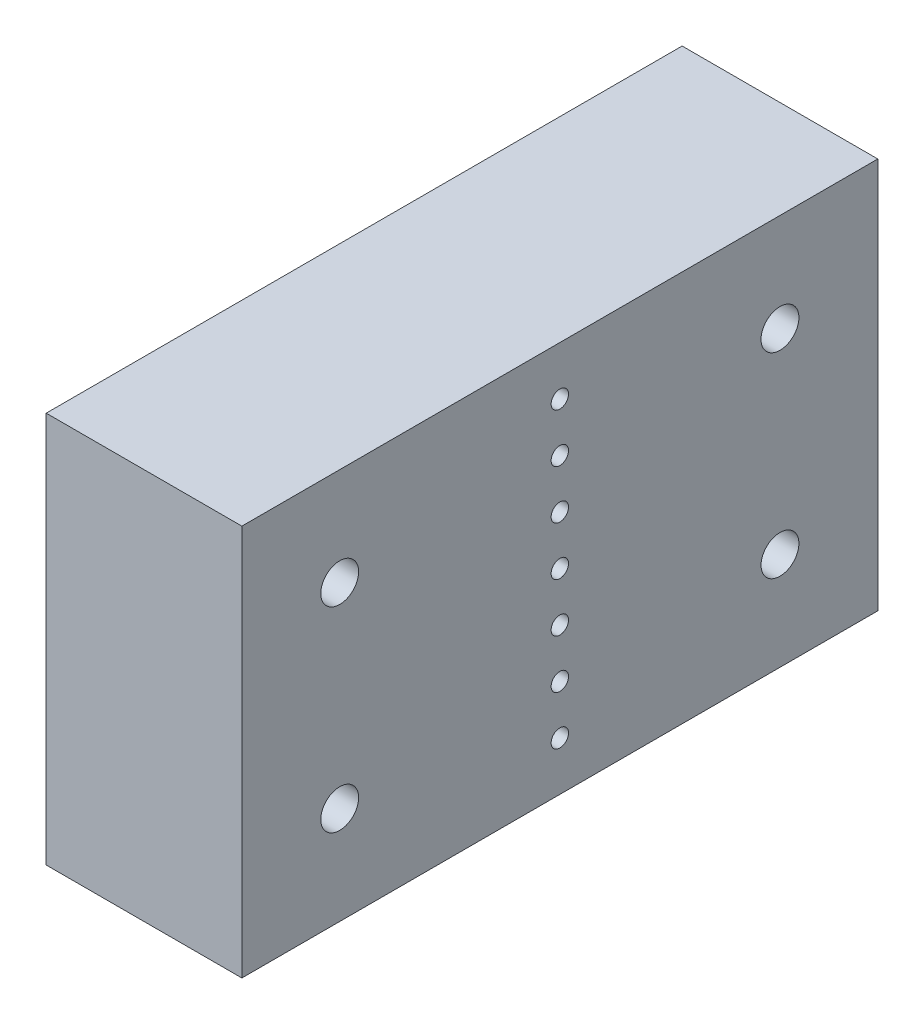
ISO-10303-21;
HEADER;
FILE_DESCRIPTION(('STEP AP214'),'2;1');
FILE_NAME('part.step','',(''),(''),'','','');
FILE_SCHEMA(('AUTOMOTIVE_DESIGN { 1 0 10303 214 1 1 1 1 }'));
ENDSEC;
DATA;
#1=APPLICATION_CONTEXT('core data for automotive mechanical design processes');
#2=APPLICATION_PROTOCOL_DEFINITION('international standard','automotive_design',2000,#1);
#3=PRODUCT_CONTEXT('',#1,'mechanical');
#4=PRODUCT('Part','Part','',(#3));
#5=PRODUCT_RELATED_PRODUCT_CATEGORY('part','',(#4));
#6=PRODUCT_DEFINITION_FORMATION('','',#4);
#7=PRODUCT_DEFINITION_CONTEXT('part definition',#1,'design');
#8=PRODUCT_DEFINITION('design','',#6,#7);
#9=PRODUCT_DEFINITION_SHAPE('','',#8);
#10=(LENGTH_UNIT() NAMED_UNIT(*) SI_UNIT(.MILLI.,.METRE.));
#11=(NAMED_UNIT(*) PLANE_ANGLE_UNIT() SI_UNIT($,.RADIAN.));
#12=(NAMED_UNIT(*) SI_UNIT($,.STERADIAN.) SOLID_ANGLE_UNIT());
#13=UNCERTAINTY_MEASURE_WITH_UNIT(LENGTH_MEASURE(1.E-05),#10,'distance_accuracy_value','');
#14=(GEOMETRIC_REPRESENTATION_CONTEXT(3) GLOBAL_UNCERTAINTY_ASSIGNED_CONTEXT((#13)) GLOBAL_UNIT_ASSIGNED_CONTEXT((#10,
#11,#12)) REPRESENTATION_CONTEXT('',''));
#15=CARTESIAN_POINT('',(0.,0.,0.));
#16=DIRECTION('',(0.,0.,1.));
#17=DIRECTION('',(1.,0.,0.));
#18=AXIS2_PLACEMENT_3D('',#15,#16,#17);
#19=CARTESIAN_POINT('',(12.7,-25.4,41.275));
#20=DIRECTION('',(0.,0.,-1.));
#21=DIRECTION('',(-1.,0.,0.));
#22=AXIS2_PLACEMENT_3D('',#19,#20,#21);
#23=PLANE('',#22);
#24=DIRECTION('',(0.,-1.,0.));
#25=VECTOR('',#24,1.);
#26=CARTESIAN_POINT('',(-12.7,-25.4,41.275));
#27=LINE('',#26,#25);
#28=CARTESIAN_POINT('',(-12.7,25.4,41.275));
#29=VERTEX_POINT('',#28);
#30=CARTESIAN_POINT('',(-12.7,-25.4,41.275));
#31=VERTEX_POINT('',#30);
#32=EDGE_CURVE('E96',#29,#31,#27,.T.);
#33=ORIENTED_EDGE('',*,*,#32,.T.);
#34=DIRECTION('',(-1.,0.,0.));
#35=VECTOR('',#34,1.);
#36=CARTESIAN_POINT('',(12.7,-25.4,41.275));
#37=LINE('',#36,#35);
#38=CARTESIAN_POINT('',(12.7,-25.4,41.275));
#39=VERTEX_POINT('',#38);
#40=EDGE_CURVE('E11',#39,#31,#37,.T.);
#41=ORIENTED_EDGE('',*,*,#40,.F.);
#42=DIRECTION('',(0.,-1.,0.));
#43=VECTOR('',#42,1.);
#44=CARTESIAN_POINT('',(12.7,-25.4,41.275));
#45=LINE('',#44,#43);
#46=CARTESIAN_POINT('',(12.7,25.4,41.275));
#47=VERTEX_POINT('',#46);
#48=EDGE_CURVE('E84',#47,#39,#45,.T.);
#49=ORIENTED_EDGE('',*,*,#48,.F.);
#50=DIRECTION('',(-1.,0.,0.));
#51=VECTOR('',#50,1.);
#52=CARTESIAN_POINT('',(12.7,25.4,41.275));
#53=LINE('',#52,#51);
#54=EDGE_CURVE('E92',#47,#29,#53,.T.);
#55=ORIENTED_EDGE('',*,*,#54,.T.);
#56=EDGE_LOOP('',(#33,#41,#49,#55));
#57=FACE_BOUND('',#56,.T.);
#58=ADVANCED_FACE('F33',(#57),#23,.F.);
#59=CARTESIAN_POINT('',(12.7,-25.4,-41.275));
#60=DIRECTION('',(0.,1.,0.));
#61=DIRECTION('',(0.,0.,1.));
#62=AXIS2_PLACEMENT_3D('',#59,#60,#61);
#63=PLANE('',#62);
#64=DIRECTION('',(0.,0.,-1.));
#65=VECTOR('',#64,1.);
#66=CARTESIAN_POINT('',(-12.7,-25.4,-41.275));
#67=LINE('',#66,#65);
#68=CARTESIAN_POINT('',(-12.7,-25.4,-41.275));
#69=VERTEX_POINT('',#68);
#70=EDGE_CURVE('E88',#31,#69,#67,.T.);
#71=ORIENTED_EDGE('',*,*,#70,.T.);
#72=DIRECTION('',(-1.,0.,0.));
#73=VECTOR('',#72,1.);
#74=CARTESIAN_POINT('',(12.7,-25.4,-41.275));
#75=LINE('',#74,#73);
#76=CARTESIAN_POINT('',(12.7,-25.4,-41.275));
#77=VERTEX_POINT('',#76);
#78=EDGE_CURVE('E41',#77,#69,#75,.T.);
#79=ORIENTED_EDGE('',*,*,#78,.F.);
#80=DIRECTION('',(0.,0.,-1.));
#81=VECTOR('',#80,1.);
#82=CARTESIAN_POINT('',(12.7,-25.4,-41.275));
#83=LINE('',#82,#81);
#84=EDGE_CURVE('E79',#39,#77,#83,.T.);
#85=ORIENTED_EDGE('',*,*,#84,.F.);
#86=ORIENTED_EDGE('',*,*,#40,.T.);
#87=EDGE_LOOP('',(#71,#79,#85,#86));
#88=FACE_BOUND('',#87,.T.);
#89=ADVANCED_FACE('F87',(#88),#63,.F.);
#90=CARTESIAN_POINT('',(12.7,-25.4,-41.275));
#91=DIRECTION('',(0.,0.,1.));
#92=DIRECTION('',(1.,0.,0.));
#93=AXIS2_PLACEMENT_3D('',#90,#91,#92);
#94=PLANE('',#93);
#95=DIRECTION('',(0.,1.,0.));
#96=VECTOR('',#95,1.);
#97=CARTESIAN_POINT('',(-12.7,-25.4,-41.275));
#98=LINE('',#97,#96);
#99=CARTESIAN_POINT('',(-12.7,25.4,-41.275));
#100=VERTEX_POINT('',#99);
#101=EDGE_CURVE('E66',#69,#100,#98,.T.);
#102=ORIENTED_EDGE('',*,*,#101,.T.);
#103=DIRECTION('',(-1.,0.,0.));
#104=VECTOR('',#103,1.);
#105=CARTESIAN_POINT('',(12.7,25.4,-41.275));
#106=LINE('',#105,#104);
#107=CARTESIAN_POINT('',(12.7,25.4,-41.275));
#108=VERTEX_POINT('',#107);
#109=EDGE_CURVE('E89',#108,#100,#106,.T.);
#110=ORIENTED_EDGE('',*,*,#109,.F.);
#111=DIRECTION('',(0.,1.,0.));
#112=VECTOR('',#111,1.);
#113=CARTESIAN_POINT('',(12.7,-25.4,-41.275));
#114=LINE('',#113,#112);
#115=EDGE_CURVE('E82',#77,#108,#114,.T.);
#116=ORIENTED_EDGE('',*,*,#115,.F.);
#117=ORIENTED_EDGE('',*,*,#78,.T.);
#118=EDGE_LOOP('',(#102,#110,#116,#117));
#119=FACE_BOUND('',#118,.T.);
#120=ADVANCED_FACE('F90',(#119),#94,.F.);
#121=CARTESIAN_POINT('',(12.7,25.4,-41.275));
#122=DIRECTION('',(0.,-1.,0.));
#123=DIRECTION('',(0.,0.,-1.));
#124=AXIS2_PLACEMENT_3D('',#121,#122,#123);
#125=PLANE('',#124);
#126=DIRECTION('',(0.,0.,1.));
#127=VECTOR('',#126,1.);
#128=CARTESIAN_POINT('',(-12.7,25.4,-41.275));
#129=LINE('',#128,#127);
#130=EDGE_CURVE('E72',#100,#29,#129,.T.);
#131=ORIENTED_EDGE('',*,*,#130,.T.);
#132=ORIENTED_EDGE('',*,*,#54,.F.);
#133=DIRECTION('',(0.,0.,1.));
#134=VECTOR('',#133,1.);
#135=CARTESIAN_POINT('',(12.7,25.4,-41.275));
#136=LINE('',#135,#134);
#137=EDGE_CURVE('E49',#108,#47,#136,.T.);
#138=ORIENTED_EDGE('',*,*,#137,.F.);
#139=ORIENTED_EDGE('',*,*,#109,.T.);
#140=EDGE_LOOP('',(#131,#132,#138,#139));
#141=FACE_BOUND('',#140,.T.);
#142=ADVANCED_FACE('F104',(#141),#125,.F.);
#143=CARTESIAN_POINT('',(12.7,0.,0.));
#144=DIRECTION('',(1.,0.,0.));
#145=DIRECTION('',(0.,0.,-1.));
#146=AXIS2_PLACEMENT_3D('',#143,#144,#145);
#147=PLANE('',#146);
#148=CARTESIAN_POINT('',(12.7,19.05,0.));
#149=DIRECTION('',(1.,0.,0.));
#150=DIRECTION('',(0.,0.,-1.));
#151=AXIS2_PLACEMENT_3D('',#148,#149,#150);
#152=CIRCLE('',#151,1.1303);
#153=CARTESIAN_POINT('',(12.7,19.05,-1.1303));
#154=VERTEX_POINT('',#153);
#155=EDGE_CURVE('E172',#154,#154,#152,.T.);
#156=ORIENTED_EDGE('',*,*,#155,.F.);
#157=EDGE_LOOP('',(#156));
#158=FACE_BOUND('',#157,.T.);
#159=CARTESIAN_POINT('',(12.7,12.7,0.));
#160=DIRECTION('',(1.,0.,0.));
#161=DIRECTION('',(0.,0.,-1.));
#162=AXIS2_PLACEMENT_3D('',#159,#160,#161);
#163=CIRCLE('',#162,1.1303);
#164=CARTESIAN_POINT('',(12.7,12.7,-1.13030000000007));
#165=VERTEX_POINT('',#164);
#166=EDGE_CURVE('E166',#165,#165,#163,.T.);
#167=ORIENTED_EDGE('',*,*,#166,.F.);
#168=EDGE_LOOP('',(#167));
#169=FACE_BOUND('',#168,.T.);
#170=CARTESIAN_POINT('',(12.7,6.35000000000001,-1.33414264368653E-13));
#171=DIRECTION('',(1.,0.,0.));
#172=DIRECTION('',(0.,0.,-1.));
#173=AXIS2_PLACEMENT_3D('',#170,#171,#172);
#174=CIRCLE('',#173,1.1303);
#175=CARTESIAN_POINT('',(12.7,6.35000000000001,-1.13030000000013));
#176=VERTEX_POINT('',#175);
#177=EDGE_CURVE('E160',#176,#176,#174,.T.);
#178=ORIENTED_EDGE('',*,*,#177,.F.);
#179=EDGE_LOOP('',(#178));
#180=FACE_BOUND('',#179,.T.);
#181=CARTESIAN_POINT('',(12.7,0.,-1.99926983873614E-13));
#182=DIRECTION('',(1.,0.,0.));
#183=DIRECTION('',(0.,0.,-1.));
#184=AXIS2_PLACEMENT_3D('',#181,#182,#183);
#185=CIRCLE('',#184,1.1303);
#186=CARTESIAN_POINT('',(12.7,0.,-1.1303000000002));
#187=VERTEX_POINT('',#186);
#188=EDGE_CURVE('E154',#187,#187,#185,.T.);
#189=ORIENTED_EDGE('',*,*,#188,.F.);
#190=EDGE_LOOP('',(#189));
#191=FACE_BOUND('',#190,.T.);
#192=CARTESIAN_POINT('',(12.7,-6.34999999999998,-2.66439703378576E-13));
#193=DIRECTION('',(1.,0.,0.));
#194=DIRECTION('',(0.,0.,-1.));
#195=AXIS2_PLACEMENT_3D('',#192,#193,#194);
#196=CIRCLE('',#195,1.1303);
#197=CARTESIAN_POINT('',(12.7,-6.34999999999998,-1.13030000000027));
#198=VERTEX_POINT('',#197);
#199=EDGE_CURVE('E148',#198,#198,#196,.T.);
#200=ORIENTED_EDGE('',*,*,#199,.F.);
#201=EDGE_LOOP('',(#200));
#202=FACE_BOUND('',#201,.T.);
#203=CARTESIAN_POINT('',(12.7,-12.7,-3.32952422883538E-13));
#204=DIRECTION('',(1.,0.,0.));
#205=DIRECTION('',(0.,0.,-1.));
#206=AXIS2_PLACEMENT_3D('',#203,#204,#205);
#207=CIRCLE('',#206,1.1303);
#208=CARTESIAN_POINT('',(12.7,-12.7,-1.13030000000033));
#209=VERTEX_POINT('',#208);
#210=EDGE_CURVE('E142',#209,#209,#207,.T.);
#211=ORIENTED_EDGE('',*,*,#210,.F.);
#212=EDGE_LOOP('',(#211));
#213=FACE_BOUND('',#212,.T.);
#214=CARTESIAN_POINT('',(12.7,-19.05,-3.99465142388499E-13));
#215=DIRECTION('',(1.,0.,0.));
#216=DIRECTION('',(0.,0.,-1.));
#217=AXIS2_PLACEMENT_3D('',#214,#215,#216);
#218=CIRCLE('',#217,1.1303);
#219=CARTESIAN_POINT('',(12.7,-19.05,-1.1303000000004));
#220=VERTEX_POINT('',#219);
#221=EDGE_CURVE('E136',#220,#220,#218,.T.);
#222=ORIENTED_EDGE('',*,*,#221,.F.);
#223=EDGE_LOOP('',(#222));
#224=FACE_BOUND('',#223,.T.);
#225=CARTESIAN_POINT('',(12.7,12.7,-28.575));
#226=DIRECTION('',(1.,0.,0.));
#227=DIRECTION('',(0.,0.,-1.));
#228=AXIS2_PLACEMENT_3D('',#225,#226,#227);
#229=CIRCLE('',#228,2.45745);
#230=CARTESIAN_POINT('',(12.7,12.7,-31.03245));
#231=VERTEX_POINT('',#230);
#232=EDGE_CURVE('E130',#231,#231,#229,.T.);
#233=ORIENTED_EDGE('',*,*,#232,.F.);
#234=EDGE_LOOP('',(#233));
#235=FACE_BOUND('',#234,.T.);
#236=CARTESIAN_POINT('',(12.7,12.6999999999996,28.575));
#237=DIRECTION('',(1.,0.,0.));
#238=DIRECTION('',(0.,0.,-1.));
#239=AXIS2_PLACEMENT_3D('',#236,#237,#238);
#240=CIRCLE('',#239,2.45745);
#241=CARTESIAN_POINT('',(12.7,12.6999999999996,26.11755));
#242=VERTEX_POINT('',#241);
#243=EDGE_CURVE('E124',#242,#242,#240,.T.);
#244=ORIENTED_EDGE('',*,*,#243,.F.);
#245=EDGE_LOOP('',(#244));
#246=FACE_BOUND('',#245,.T.);
#247=CARTESIAN_POINT('',(12.7,-12.7000000000004,28.5749999999997));
#248=DIRECTION('',(1.,0.,0.));
#249=DIRECTION('',(0.,0.,-1.));
#250=AXIS2_PLACEMENT_3D('',#247,#248,#249);
#251=CIRCLE('',#250,2.45745);
#252=CARTESIAN_POINT('',(12.7,-12.7000000000004,26.1175499999997));
#253=VERTEX_POINT('',#252);
#254=EDGE_CURVE('E118',#253,#253,#251,.T.);
#255=ORIENTED_EDGE('',*,*,#254,.F.);
#256=EDGE_LOOP('',(#255));
#257=FACE_BOUND('',#256,.T.);
#258=CARTESIAN_POINT('',(12.7,-12.7,-28.5750000000003));
#259=DIRECTION('',(1.,0.,0.));
#260=DIRECTION('',(0.,0.,-1.));
#261=AXIS2_PLACEMENT_3D('',#258,#259,#260);
#262=CIRCLE('',#261,2.45745);
#263=CARTESIAN_POINT('',(12.7,-12.7,-31.0324500000003));
#264=VERTEX_POINT('',#263);
#265=EDGE_CURVE('E112',#264,#264,#262,.T.);
#266=ORIENTED_EDGE('',*,*,#265,.F.);
#267=EDGE_LOOP('',(#266));
#268=FACE_BOUND('',#267,.T.);
#269=ORIENTED_EDGE('',*,*,#48,.T.);
#270=ORIENTED_EDGE('',*,*,#84,.T.);
#271=ORIENTED_EDGE('',*,*,#115,.T.);
#272=ORIENTED_EDGE('',*,*,#137,.T.);
#273=EDGE_LOOP('',(#269,#270,#271,#272));
#274=FACE_BOUND('',#273,.T.);
#275=ADVANCED_FACE('F80',(#158,#169,#180,#191,#202,#213,#224,#235,#246,#257,#268,#274),#147,.T.);
#276=CARTESIAN_POINT('',(-12.7,0.,0.));
#277=DIRECTION('',(1.,0.,0.));
#278=DIRECTION('',(0.,0.,-1.));
#279=AXIS2_PLACEMENT_3D('',#276,#277,#278);
#280=PLANE('',#279);
#281=CARTESIAN_POINT('',(-12.7,19.05,0.));
#282=DIRECTION('',(1.,0.,0.));
#283=DIRECTION('',(0.,0.,-1.));
#284=AXIS2_PLACEMENT_3D('',#281,#282,#283);
#285=CIRCLE('',#284,1.1303);
#286=CARTESIAN_POINT('',(-12.7,19.05,-1.1303));
#287=VERTEX_POINT('',#286);
#288=EDGE_CURVE('E169',#287,#287,#285,.T.);
#289=ORIENTED_EDGE('',*,*,#288,.T.);
#290=EDGE_LOOP('',(#289));
#291=FACE_BOUND('',#290,.T.);
#292=CARTESIAN_POINT('',(-12.7,12.7,0.));
#293=DIRECTION('',(1.,0.,0.));
#294=DIRECTION('',(0.,0.,-1.));
#295=AXIS2_PLACEMENT_3D('',#292,#293,#294);
#296=CIRCLE('',#295,1.1303);
#297=CARTESIAN_POINT('',(-12.7,12.7,-1.13030000000006));
#298=VERTEX_POINT('',#297);
#299=EDGE_CURVE('E163',#298,#298,#296,.T.);
#300=ORIENTED_EDGE('',*,*,#299,.T.);
#301=EDGE_LOOP('',(#300));
#302=FACE_BOUND('',#301,.T.);
#303=CARTESIAN_POINT('',(-12.7,6.35000000000001,-1.33414264368653E-13));
#304=DIRECTION('',(1.,0.,0.));
#305=DIRECTION('',(0.,0.,-1.));
#306=AXIS2_PLACEMENT_3D('',#303,#304,#305);
#307=CIRCLE('',#306,1.1303);
#308=CARTESIAN_POINT('',(-12.7,6.35000000000001,-1.13030000000013));
#309=VERTEX_POINT('',#308);
#310=EDGE_CURVE('E157',#309,#309,#307,.T.);
#311=ORIENTED_EDGE('',*,*,#310,.T.);
#312=EDGE_LOOP('',(#311));
#313=FACE_BOUND('',#312,.T.);
#314=CARTESIAN_POINT('',(-12.7,0.,-1.99926983873614E-13));
#315=DIRECTION('',(1.,0.,0.));
#316=DIRECTION('',(0.,0.,-1.));
#317=AXIS2_PLACEMENT_3D('',#314,#315,#316);
#318=CIRCLE('',#317,1.1303);
#319=CARTESIAN_POINT('',(-12.7,0.,-1.1303000000002));
#320=VERTEX_POINT('',#319);
#321=EDGE_CURVE('E151',#320,#320,#318,.T.);
#322=ORIENTED_EDGE('',*,*,#321,.T.);
#323=EDGE_LOOP('',(#322));
#324=FACE_BOUND('',#323,.T.);
#325=CARTESIAN_POINT('',(-12.7,-6.34999999999998,-2.66439703378576E-13));
#326=DIRECTION('',(1.,0.,0.));
#327=DIRECTION('',(0.,0.,-1.));
#328=AXIS2_PLACEMENT_3D('',#325,#326,#327);
#329=CIRCLE('',#328,1.1303);
#330=CARTESIAN_POINT('',(-12.7,-6.34999999999998,-1.13030000000026));
#331=VERTEX_POINT('',#330);
#332=EDGE_CURVE('E145',#331,#331,#329,.T.);
#333=ORIENTED_EDGE('',*,*,#332,.T.);
#334=EDGE_LOOP('',(#333));
#335=FACE_BOUND('',#334,.T.);
#336=CARTESIAN_POINT('',(-12.7,-12.7,-3.32952422883538E-13));
#337=DIRECTION('',(1.,0.,0.));
#338=DIRECTION('',(0.,0.,-1.));
#339=AXIS2_PLACEMENT_3D('',#336,#337,#338);
#340=CIRCLE('',#339,1.1303);
#341=CARTESIAN_POINT('',(-12.7,-12.7,-1.13030000000033));
#342=VERTEX_POINT('',#341);
#343=EDGE_CURVE('E139',#342,#342,#340,.T.);
#344=ORIENTED_EDGE('',*,*,#343,.T.);
#345=EDGE_LOOP('',(#344));
#346=FACE_BOUND('',#345,.T.);
#347=CARTESIAN_POINT('',(-12.7,-19.05,-3.99465142388499E-13));
#348=DIRECTION('',(1.,0.,0.));
#349=DIRECTION('',(0.,0.,-1.));
#350=AXIS2_PLACEMENT_3D('',#347,#348,#349);
#351=CIRCLE('',#350,1.1303);
#352=CARTESIAN_POINT('',(-12.7,-19.05,-1.1303000000004));
#353=VERTEX_POINT('',#352);
#354=EDGE_CURVE('E133',#353,#353,#351,.T.);
#355=ORIENTED_EDGE('',*,*,#354,.T.);
#356=EDGE_LOOP('',(#355));
#357=FACE_BOUND('',#356,.T.);
#358=CARTESIAN_POINT('',(-12.7,12.7,-28.575));
#359=DIRECTION('',(1.,0.,0.));
#360=DIRECTION('',(0.,0.,-1.));
#361=AXIS2_PLACEMENT_3D('',#358,#359,#360);
#362=CIRCLE('',#361,2.45744999999999);
#363=CARTESIAN_POINT('',(-12.7,12.7,-31.03245));
#364=VERTEX_POINT('',#363);
#365=EDGE_CURVE('E127',#364,#364,#362,.T.);
#366=ORIENTED_EDGE('',*,*,#365,.T.);
#367=EDGE_LOOP('',(#366));
#368=FACE_BOUND('',#367,.T.);
#369=CARTESIAN_POINT('',(-12.7,12.6999999999996,28.575));
#370=DIRECTION('',(1.,0.,0.));
#371=DIRECTION('',(0.,0.,-1.));
#372=AXIS2_PLACEMENT_3D('',#369,#370,#371);
#373=CIRCLE('',#372,2.45744999999999);
#374=CARTESIAN_POINT('',(-12.7,12.6999999999996,26.11755));
#375=VERTEX_POINT('',#374);
#376=EDGE_CURVE('E121',#375,#375,#373,.T.);
#377=ORIENTED_EDGE('',*,*,#376,.T.);
#378=EDGE_LOOP('',(#377));
#379=FACE_BOUND('',#378,.T.);
#380=CARTESIAN_POINT('',(-12.7,-12.7000000000004,28.5749999999997));
#381=DIRECTION('',(1.,0.,0.));
#382=DIRECTION('',(0.,0.,-1.));
#383=AXIS2_PLACEMENT_3D('',#380,#381,#382);
#384=CIRCLE('',#383,2.45744999999999);
#385=CARTESIAN_POINT('',(-12.7,-12.7000000000004,26.1175499999997));
#386=VERTEX_POINT('',#385);
#387=EDGE_CURVE('E115',#386,#386,#384,.T.);
#388=ORIENTED_EDGE('',*,*,#387,.T.);
#389=EDGE_LOOP('',(#388));
#390=FACE_BOUND('',#389,.T.);
#391=CARTESIAN_POINT('',(-12.7,-12.7,-28.5750000000003));
#392=DIRECTION('',(1.,0.,0.));
#393=DIRECTION('',(0.,0.,-1.));
#394=AXIS2_PLACEMENT_3D('',#391,#392,#393);
#395=CIRCLE('',#394,2.45744999999999);
#396=CARTESIAN_POINT('',(-12.7,-12.7,-31.0324500000003));
#397=VERTEX_POINT('',#396);
#398=EDGE_CURVE('E99',#397,#397,#395,.T.);
#399=ORIENTED_EDGE('',*,*,#398,.T.);
#400=EDGE_LOOP('',(#399));
#401=FACE_BOUND('',#400,.T.);
#402=ORIENTED_EDGE('',*,*,#32,.F.);
#403=ORIENTED_EDGE('',*,*,#130,.F.);
#404=ORIENTED_EDGE('',*,*,#101,.F.);
#405=ORIENTED_EDGE('',*,*,#70,.F.);
#406=EDGE_LOOP('',(#402,#403,#404,#405));
#407=FACE_BOUND('',#406,.T.);
#408=ADVANCED_FACE('F107',(#291,#302,#313,#324,#335,#346,#357,#368,#379,#390,#401,#407),#280,.F.);
#409=CARTESIAN_POINT('',(12.7,-12.7,-28.5750000000003));
#410=DIRECTION('',(1.,0.,0.));
#411=DIRECTION('',(0.,0.,-1.));
#412=AXIS2_PLACEMENT_3D('',#409,#410,#411);
#413=CYLINDRICAL_SURFACE('',#412,2.45745);
#414=ORIENTED_EDGE('',*,*,#398,.F.);
#415=EDGE_LOOP('',(#414));
#416=FACE_BOUND('',#415,.T.);
#417=ORIENTED_EDGE('',*,*,#265,.T.);
#418=EDGE_LOOP('',(#417));
#419=FACE_BOUND('',#418,.T.);
#420=ADVANCED_FACE('F201',(#416,#419),#413,.F.);
#421=CARTESIAN_POINT('',(12.7,-12.7000000000004,28.5749999999997));
#422=DIRECTION('',(1.,0.,0.));
#423=DIRECTION('',(0.,0.,-1.));
#424=AXIS2_PLACEMENT_3D('',#421,#422,#423);
#425=CYLINDRICAL_SURFACE('',#424,2.45745);
#426=ORIENTED_EDGE('',*,*,#387,.F.);
#427=EDGE_LOOP('',(#426));
#428=FACE_BOUND('',#427,.T.);
#429=ORIENTED_EDGE('',*,*,#254,.T.);
#430=EDGE_LOOP('',(#429));
#431=FACE_BOUND('',#430,.T.);
#432=ADVANCED_FACE('F203',(#428,#431),#425,.F.);
#433=CARTESIAN_POINT('',(12.7,12.6999999999996,28.575));
#434=DIRECTION('',(1.,0.,0.));
#435=DIRECTION('',(0.,0.,-1.));
#436=AXIS2_PLACEMENT_3D('',#433,#434,#435);
#437=CYLINDRICAL_SURFACE('',#436,2.45745);
#438=ORIENTED_EDGE('',*,*,#376,.F.);
#439=EDGE_LOOP('',(#438));
#440=FACE_BOUND('',#439,.T.);
#441=ORIENTED_EDGE('',*,*,#243,.T.);
#442=EDGE_LOOP('',(#441));
#443=FACE_BOUND('',#442,.T.);
#444=ADVANCED_FACE('F210',(#440,#443),#437,.F.);
#445=CARTESIAN_POINT('',(12.7,12.7,-28.575));
#446=DIRECTION('',(1.,0.,0.));
#447=DIRECTION('',(0.,0.,-1.));
#448=AXIS2_PLACEMENT_3D('',#445,#446,#447);
#449=CYLINDRICAL_SURFACE('',#448,2.45745);
#450=ORIENTED_EDGE('',*,*,#365,.F.);
#451=EDGE_LOOP('',(#450));
#452=FACE_BOUND('',#451,.T.);
#453=ORIENTED_EDGE('',*,*,#232,.T.);
#454=EDGE_LOOP('',(#453));
#455=FACE_BOUND('',#454,.T.);
#456=ADVANCED_FACE('F251',(#452,#455),#449,.F.);
#457=CARTESIAN_POINT('',(12.7,-19.05,-3.99465142388499E-13));
#458=DIRECTION('',(1.,0.,0.));
#459=DIRECTION('',(0.,0.,-1.));
#460=AXIS2_PLACEMENT_3D('',#457,#458,#459);
#461=CYLINDRICAL_SURFACE('',#460,1.1303);
#462=ORIENTED_EDGE('',*,*,#354,.F.);
#463=EDGE_LOOP('',(#462));
#464=FACE_BOUND('',#463,.T.);
#465=ORIENTED_EDGE('',*,*,#221,.T.);
#466=EDGE_LOOP('',(#465));
#467=FACE_BOUND('',#466,.T.);
#468=ADVANCED_FACE('F245',(#464,#467),#461,.F.);
#469=CARTESIAN_POINT('',(12.7,-12.7,-3.32952422883538E-13));
#470=DIRECTION('',(1.,0.,0.));
#471=DIRECTION('',(0.,0.,-1.));
#472=AXIS2_PLACEMENT_3D('',#469,#470,#471);
#473=CYLINDRICAL_SURFACE('',#472,1.1303);
#474=ORIENTED_EDGE('',*,*,#343,.F.);
#475=EDGE_LOOP('',(#474));
#476=FACE_BOUND('',#475,.T.);
#477=ORIENTED_EDGE('',*,*,#210,.T.);
#478=EDGE_LOOP('',(#477));
#479=FACE_BOUND('',#478,.T.);
#480=ADVANCED_FACE('F250',(#476,#479),#473,.F.);
#481=CARTESIAN_POINT('',(12.7,-6.34999999999998,-2.66439703378576E-13));
#482=DIRECTION('',(1.,0.,0.));
#483=DIRECTION('',(0.,0.,-1.));
#484=AXIS2_PLACEMENT_3D('',#481,#482,#483);
#485=CYLINDRICAL_SURFACE('',#484,1.1303);
#486=ORIENTED_EDGE('',*,*,#332,.F.);
#487=EDGE_LOOP('',(#486));
#488=FACE_BOUND('',#487,.T.);
#489=ORIENTED_EDGE('',*,*,#199,.T.);
#490=EDGE_LOOP('',(#489));
#491=FACE_BOUND('',#490,.T.);
#492=ADVANCED_FACE('F263',(#488,#491),#485,.F.);
#493=CARTESIAN_POINT('',(12.7,0.,-1.99926983873614E-13));
#494=DIRECTION('',(1.,0.,0.));
#495=DIRECTION('',(0.,0.,-1.));
#496=AXIS2_PLACEMENT_3D('',#493,#494,#495);
#497=CYLINDRICAL_SURFACE('',#496,1.1303);
#498=ORIENTED_EDGE('',*,*,#321,.F.);
#499=EDGE_LOOP('',(#498));
#500=FACE_BOUND('',#499,.T.);
#501=ORIENTED_EDGE('',*,*,#188,.T.);
#502=EDGE_LOOP('',(#501));
#503=FACE_BOUND('',#502,.T.);
#504=ADVANCED_FACE('F273',(#500,#503),#497,.F.);
#505=CARTESIAN_POINT('',(12.7,6.35000000000001,-1.33414264368653E-13));
#506=DIRECTION('',(1.,0.,0.));
#507=DIRECTION('',(0.,0.,-1.));
#508=AXIS2_PLACEMENT_3D('',#505,#506,#507);
#509=CYLINDRICAL_SURFACE('',#508,1.1303);
#510=ORIENTED_EDGE('',*,*,#310,.F.);
#511=EDGE_LOOP('',(#510));
#512=FACE_BOUND('',#511,.T.);
#513=ORIENTED_EDGE('',*,*,#177,.T.);
#514=EDGE_LOOP('',(#513));
#515=FACE_BOUND('',#514,.T.);
#516=ADVANCED_FACE('F283',(#512,#515),#509,.F.);
#517=CARTESIAN_POINT('',(12.7,12.7,0.));
#518=DIRECTION('',(1.,0.,0.));
#519=DIRECTION('',(0.,0.,-1.));
#520=AXIS2_PLACEMENT_3D('',#517,#518,#519);
#521=CYLINDRICAL_SURFACE('',#520,1.1303);
#522=ORIENTED_EDGE('',*,*,#299,.F.);
#523=EDGE_LOOP('',(#522));
#524=FACE_BOUND('',#523,.T.);
#525=ORIENTED_EDGE('',*,*,#166,.T.);
#526=EDGE_LOOP('',(#525));
#527=FACE_BOUND('',#526,.T.);
#528=ADVANCED_FACE('F293',(#524,#527),#521,.F.);
#529=CARTESIAN_POINT('',(12.7,19.05,0.));
#530=DIRECTION('',(1.,0.,0.));
#531=DIRECTION('',(0.,0.,-1.));
#532=AXIS2_PLACEMENT_3D('',#529,#530,#531);
#533=CYLINDRICAL_SURFACE('',#532,1.1303);
#534=ORIENTED_EDGE('',*,*,#288,.F.);
#535=EDGE_LOOP('',(#534));
#536=FACE_BOUND('',#535,.T.);
#537=ORIENTED_EDGE('',*,*,#155,.T.);
#538=EDGE_LOOP('',(#537));
#539=FACE_BOUND('',#538,.T.);
#540=ADVANCED_FACE('F176',(#536,#539),#533,.F.);
#541=CLOSED_SHELL('',(#58,#89,#120,#142,#275,#408,#420,#432,#444,#456,#468,#480,#492,#504,#516,
#528,#540));
#542=MANIFOLD_SOLID_BREP('B2',#541);
#543=ADVANCED_BREP_SHAPE_REPRESENTATION('',(#18,#542),#14);
#544=SHAPE_DEFINITION_REPRESENTATION(#9,#543);
ENDSEC;
END-ISO-10303-21;
